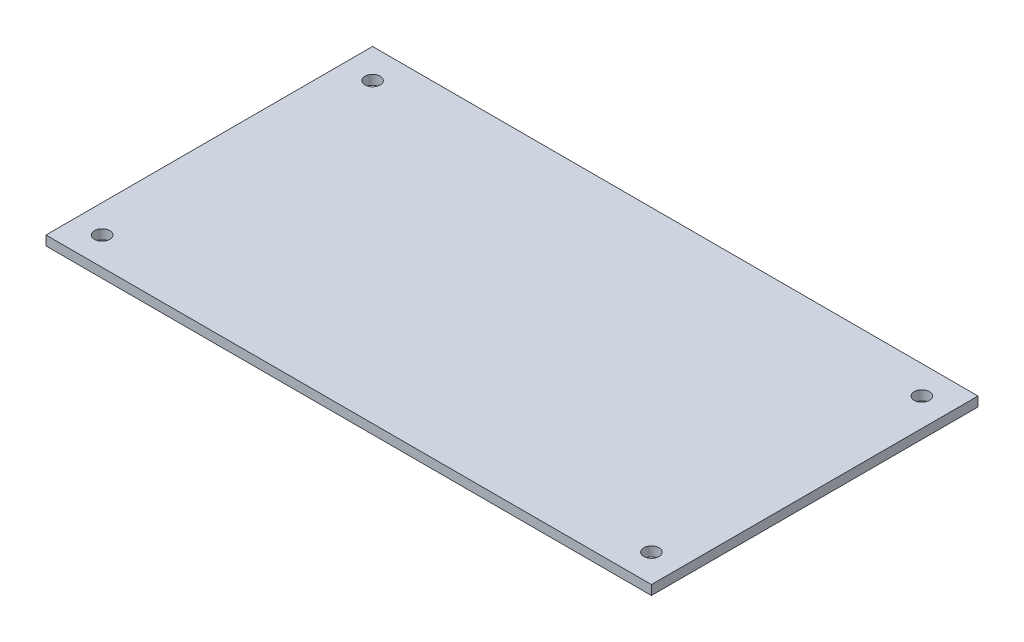
ISO-10303-21;
HEADER;
FILE_DESCRIPTION(('STEP AP214'),'2;1');
FILE_NAME('part.step','',(''),(''),'','','');
FILE_SCHEMA(('AUTOMOTIVE_DESIGN { 1 0 10303 214 1 1 1 1 }'));
ENDSEC;
DATA;
#1=APPLICATION_CONTEXT('core data for automotive mechanical design processes');
#2=APPLICATION_PROTOCOL_DEFINITION('international standard','automotive_design',2000,#1);
#3=PRODUCT_CONTEXT('',#1,'mechanical');
#4=PRODUCT('Part','Part','',(#3));
#5=PRODUCT_RELATED_PRODUCT_CATEGORY('part','',(#4));
#6=PRODUCT_DEFINITION_FORMATION('','',#4);
#7=PRODUCT_DEFINITION_CONTEXT('part definition',#1,'design');
#8=PRODUCT_DEFINITION('design','',#6,#7);
#9=PRODUCT_DEFINITION_SHAPE('','',#8);
#10=(LENGTH_UNIT() NAMED_UNIT(*) SI_UNIT(.MILLI.,.METRE.));
#11=(NAMED_UNIT(*) PLANE_ANGLE_UNIT() SI_UNIT($,.RADIAN.));
#12=(NAMED_UNIT(*) SI_UNIT($,.STERADIAN.) SOLID_ANGLE_UNIT());
#13=UNCERTAINTY_MEASURE_WITH_UNIT(LENGTH_MEASURE(1.E-05),#10,'distance_accuracy_value','');
#14=(GEOMETRIC_REPRESENTATION_CONTEXT(3) GLOBAL_UNCERTAINTY_ASSIGNED_CONTEXT((#13)) GLOBAL_UNIT_ASSIGNED_CONTEXT((#10,
#11,#12)) REPRESENTATION_CONTEXT('',''));
#15=CARTESIAN_POINT('',(0.,0.,0.));
#16=DIRECTION('',(0.,0.,1.));
#17=DIRECTION('',(1.,0.,0.));
#18=AXIS2_PLACEMENT_3D('',#15,#16,#17);
#19=CARTESIAN_POINT('',(26.7239382239382,2.,42.0212355212355));
#20=DIRECTION('',(-1.,0.,0.));
#21=DIRECTION('',(0.,0.,1.));
#22=AXIS2_PLACEMENT_3D('',#19,#20,#21);
#23=PLANE('',#22);
#24=DIRECTION('',(0.,0.,-1.));
#25=VECTOR('',#24,1.);
#26=CARTESIAN_POINT('',(26.7239382239382,0.,42.0212355212355));
#27=LINE('',#26,#25);
#28=CARTESIAN_POINT('',(26.7239382239382,0.,42.0212355212355));
#29=VERTEX_POINT('',#28);
#30=CARTESIAN_POINT('',(26.7239382239382,0.,-26.4787644787645));
#31=VERTEX_POINT('',#30);
#32=EDGE_CURVE('E96',#29,#31,#27,.T.);
#33=ORIENTED_EDGE('',*,*,#32,.T.);
#34=DIRECTION('',(0.,-1.,0.));
#35=VECTOR('',#34,1.);
#36=CARTESIAN_POINT('',(26.7239382239382,2.,-26.4787644787645));
#37=LINE('',#36,#35);
#38=CARTESIAN_POINT('',(26.7239382239382,2.,-26.4787644787645));
#39=VERTEX_POINT('',#38);
#40=EDGE_CURVE('E11',#39,#31,#37,.T.);
#41=ORIENTED_EDGE('',*,*,#40,.F.);
#42=DIRECTION('',(0.,0.,-1.));
#43=VECTOR('',#42,1.);
#44=CARTESIAN_POINT('',(26.7239382239382,2.,42.0212355212355));
#45=LINE('',#44,#43);
#46=CARTESIAN_POINT('',(26.7239382239382,2.,42.0212355212355));
#47=VERTEX_POINT('',#46);
#48=EDGE_CURVE('E84',#47,#39,#45,.T.);
#49=ORIENTED_EDGE('',*,*,#48,.F.);
#50=DIRECTION('',(0.,-1.,0.));
#51=VECTOR('',#50,1.);
#52=CARTESIAN_POINT('',(26.7239382239382,2.,42.0212355212355));
#53=LINE('',#52,#51);
#54=EDGE_CURVE('E92',#47,#29,#53,.T.);
#55=ORIENTED_EDGE('',*,*,#54,.T.);
#56=EDGE_LOOP('',(#33,#41,#49,#55));
#57=FACE_BOUND('',#56,.T.);
#58=ADVANCED_FACE('F33',(#57),#23,.F.);
#59=CARTESIAN_POINT('',(-100.276061776062,2.,-26.4787644787645));
#60=DIRECTION('',(0.,0.,1.));
#61=DIRECTION('',(1.,0.,0.));
#62=AXIS2_PLACEMENT_3D('',#59,#60,#61);
#63=PLANE('',#62);
#64=DIRECTION('',(-1.,0.,0.));
#65=VECTOR('',#64,1.);
#66=CARTESIAN_POINT('',(-100.276061776062,0.,-26.4787644787645));
#67=LINE('',#66,#65);
#68=CARTESIAN_POINT('',(-100.276061776062,0.,-26.4787644787645));
#69=VERTEX_POINT('',#68);
#70=EDGE_CURVE('E88',#31,#69,#67,.T.);
#71=ORIENTED_EDGE('',*,*,#70,.T.);
#72=DIRECTION('',(0.,-1.,0.));
#73=VECTOR('',#72,1.);
#74=CARTESIAN_POINT('',(-100.276061776062,2.,-26.4787644787645));
#75=LINE('',#74,#73);
#76=CARTESIAN_POINT('',(-100.276061776062,2.,-26.4787644787645));
#77=VERTEX_POINT('',#76);
#78=EDGE_CURVE('E41',#77,#69,#75,.T.);
#79=ORIENTED_EDGE('',*,*,#78,.F.);
#80=DIRECTION('',(-1.,0.,0.));
#81=VECTOR('',#80,1.);
#82=CARTESIAN_POINT('',(-100.276061776062,2.,-26.4787644787645));
#83=LINE('',#82,#81);
#84=EDGE_CURVE('E79',#39,#77,#83,.T.);
#85=ORIENTED_EDGE('',*,*,#84,.F.);
#86=ORIENTED_EDGE('',*,*,#40,.T.);
#87=EDGE_LOOP('',(#71,#79,#85,#86));
#88=FACE_BOUND('',#87,.T.);
#89=ADVANCED_FACE('F87',(#88),#63,.F.);
#90=CARTESIAN_POINT('',(-100.276061776062,2.,42.0212355212355));
#91=DIRECTION('',(1.,0.,0.));
#92=DIRECTION('',(0.,0.,-1.));
#93=AXIS2_PLACEMENT_3D('',#90,#91,#92);
#94=PLANE('',#93);
#95=DIRECTION('',(0.,0.,1.));
#96=VECTOR('',#95,1.);
#97=CARTESIAN_POINT('',(-100.276061776062,0.,42.0212355212355));
#98=LINE('',#97,#96);
#99=CARTESIAN_POINT('',(-100.276061776062,0.,42.0212355212355));
#100=VERTEX_POINT('',#99);
#101=EDGE_CURVE('E66',#69,#100,#98,.T.);
#102=ORIENTED_EDGE('',*,*,#101,.T.);
#103=DIRECTION('',(0.,-1.,0.));
#104=VECTOR('',#103,1.);
#105=CARTESIAN_POINT('',(-100.276061776062,2.,42.0212355212355));
#106=LINE('',#105,#104);
#107=CARTESIAN_POINT('',(-100.276061776062,2.,42.0212355212355));
#108=VERTEX_POINT('',#107);
#109=EDGE_CURVE('E89',#108,#100,#106,.T.);
#110=ORIENTED_EDGE('',*,*,#109,.F.);
#111=DIRECTION('',(0.,0.,1.));
#112=VECTOR('',#111,1.);
#113=CARTESIAN_POINT('',(-100.276061776062,2.,42.0212355212355));
#114=LINE('',#113,#112);
#115=EDGE_CURVE('E82',#77,#108,#114,.T.);
#116=ORIENTED_EDGE('',*,*,#115,.F.);
#117=ORIENTED_EDGE('',*,*,#78,.T.);
#118=EDGE_LOOP('',(#102,#110,#116,#117));
#119=FACE_BOUND('',#118,.T.);
#120=ADVANCED_FACE('F90',(#119),#94,.F.);
#121=CARTESIAN_POINT('',(-100.276061776062,2.,42.0212355212355));
#122=DIRECTION('',(0.,0.,-1.));
#123=DIRECTION('',(-1.,0.,0.));
#124=AXIS2_PLACEMENT_3D('',#121,#122,#123);
#125=PLANE('',#124);
#126=DIRECTION('',(1.,0.,0.));
#127=VECTOR('',#126,1.);
#128=CARTESIAN_POINT('',(-100.276061776062,0.,42.0212355212355));
#129=LINE('',#128,#127);
#130=EDGE_CURVE('E72',#100,#29,#129,.T.);
#131=ORIENTED_EDGE('',*,*,#130,.T.);
#132=ORIENTED_EDGE('',*,*,#54,.F.);
#133=DIRECTION('',(1.,0.,0.));
#134=VECTOR('',#133,1.);
#135=CARTESIAN_POINT('',(-100.276061776062,2.,42.0212355212355));
#136=LINE('',#135,#134);
#137=EDGE_CURVE('E49',#108,#47,#136,.T.);
#138=ORIENTED_EDGE('',*,*,#137,.F.);
#139=ORIENTED_EDGE('',*,*,#109,.T.);
#140=EDGE_LOOP('',(#131,#132,#138,#139));
#141=FACE_BOUND('',#140,.T.);
#142=ADVANCED_FACE('F104',(#141),#125,.F.);
#143=CARTESIAN_POINT('',(0.,2.,0.));
#144=DIRECTION('',(0.,-1.,0.));
#145=DIRECTION('',(0.,0.,-1.));
#146=AXIS2_PLACEMENT_3D('',#143,#144,#145);
#147=PLANE('',#146);
#148=CARTESIAN_POINT('',(20.8339382239382,2.,-20.5887644787645));
#149=DIRECTION('',(0.,1.,0.));
#150=DIRECTION('',(0.,0.,1.));
#151=AXIS2_PLACEMENT_3D('',#148,#149,#150);
#152=CIRCLE('',#151,1.6);
#153=CARTESIAN_POINT('',(20.8339382239382,2.,-18.9887644787645));
#154=VERTEX_POINT('',#153);
#155=EDGE_CURVE('E116',#154,#154,#152,.T.);
#156=ORIENTED_EDGE('',*,*,#155,.F.);
#157=EDGE_LOOP('',(#156));
#158=FACE_BOUND('',#157,.T.);
#159=CARTESIAN_POINT('',(20.8339382239382,2.,36.1312355212355));
#160=DIRECTION('',(0.,1.,0.));
#161=DIRECTION('',(0.,0.,1.));
#162=AXIS2_PLACEMENT_3D('',#159,#160,#161);
#163=CIRCLE('',#162,1.6);
#164=CARTESIAN_POINT('',(20.8339382239382,2.,37.7312355212355));
#165=VERTEX_POINT('',#164);
#166=EDGE_CURVE('E122',#165,#165,#163,.T.);
#167=ORIENTED_EDGE('',*,*,#166,.F.);
#168=EDGE_LOOP('',(#167));
#169=FACE_BOUND('',#168,.T.);
#170=CARTESIAN_POINT('',(-94.3860617760618,2.,36.1312355212355));
#171=DIRECTION('',(0.,1.,0.));
#172=DIRECTION('',(0.,0.,1.));
#173=AXIS2_PLACEMENT_3D('',#170,#171,#172);
#174=CIRCLE('',#173,1.60000000000001);
#175=CARTESIAN_POINT('',(-94.3860617760618,2.,37.7312355212355));
#176=VERTEX_POINT('',#175);
#177=EDGE_CURVE('E128',#176,#176,#174,.T.);
#178=ORIENTED_EDGE('',*,*,#177,.F.);
#179=EDGE_LOOP('',(#178));
#180=FACE_BOUND('',#179,.T.);
#181=CARTESIAN_POINT('',(-94.0760617760618,2.,-20.2787644787645));
#182=DIRECTION('',(0.,1.,0.));
#183=DIRECTION('',(0.,0.,1.));
#184=AXIS2_PLACEMENT_3D('',#181,#182,#183);
#185=CIRCLE('',#184,1.6);
#186=CARTESIAN_POINT('',(-94.0760617760618,2.,-18.6787644787645));
#187=VERTEX_POINT('',#186);
#188=EDGE_CURVE('E110',#187,#187,#185,.T.);
#189=ORIENTED_EDGE('',*,*,#188,.F.);
#190=EDGE_LOOP('',(#189));
#191=FACE_BOUND('',#190,.T.);
#192=ORIENTED_EDGE('',*,*,#48,.T.);
#193=ORIENTED_EDGE('',*,*,#84,.T.);
#194=ORIENTED_EDGE('',*,*,#115,.T.);
#195=ORIENTED_EDGE('',*,*,#137,.T.);
#196=EDGE_LOOP('',(#192,#193,#194,#195));
#197=FACE_BOUND('',#196,.T.);
#198=ADVANCED_FACE('F80',(#158,#169,#180,#191,#197),#147,.F.);
#199=CARTESIAN_POINT('',(0.,0.,0.));
#200=DIRECTION('',(0.,-1.,0.));
#201=DIRECTION('',(0.,0.,-1.));
#202=AXIS2_PLACEMENT_3D('',#199,#200,#201);
#203=PLANE('',#202);
#204=CARTESIAN_POINT('',(20.8339382239382,0.,-20.5887644787645));
#205=DIRECTION('',(0.,1.,0.));
#206=DIRECTION('',(0.,0.,1.));
#207=AXIS2_PLACEMENT_3D('',#204,#205,#206);
#208=CIRCLE('',#207,1.6);
#209=CARTESIAN_POINT('',(20.8339382239382,0.,-18.9887644787645));
#210=VERTEX_POINT('',#209);
#211=EDGE_CURVE('E119',#210,#210,#208,.T.);
#212=ORIENTED_EDGE('',*,*,#211,.T.);
#213=EDGE_LOOP('',(#212));
#214=FACE_BOUND('',#213,.T.);
#215=CARTESIAN_POINT('',(20.8339382239382,0.,36.1312355212355));
#216=DIRECTION('',(0.,1.,0.));
#217=DIRECTION('',(0.,0.,1.));
#218=AXIS2_PLACEMENT_3D('',#215,#216,#217);
#219=CIRCLE('',#218,1.6);
#220=CARTESIAN_POINT('',(20.8339382239382,0.,37.7312355212355));
#221=VERTEX_POINT('',#220);
#222=EDGE_CURVE('E125',#221,#221,#219,.T.);
#223=ORIENTED_EDGE('',*,*,#222,.T.);
#224=EDGE_LOOP('',(#223));
#225=FACE_BOUND('',#224,.T.);
#226=CARTESIAN_POINT('',(-94.3860617760618,0.,36.1312355212355));
#227=DIRECTION('',(0.,1.,0.));
#228=DIRECTION('',(0.,0.,1.));
#229=AXIS2_PLACEMENT_3D('',#226,#227,#228);
#230=CIRCLE('',#229,1.60000000000001);
#231=CARTESIAN_POINT('',(-94.3860617760618,0.,37.7312355212355));
#232=VERTEX_POINT('',#231);
#233=EDGE_CURVE('E113',#232,#232,#230,.T.);
#234=ORIENTED_EDGE('',*,*,#233,.T.);
#235=EDGE_LOOP('',(#234));
#236=FACE_BOUND('',#235,.T.);
#237=CARTESIAN_POINT('',(-94.0760617760618,0.,-20.2787644787645));
#238=DIRECTION('',(0.,1.,0.));
#239=DIRECTION('',(0.,0.,1.));
#240=AXIS2_PLACEMENT_3D('',#237,#238,#239);
#241=CIRCLE('',#240,1.6);
#242=CARTESIAN_POINT('',(-94.0760617760618,0.,-18.6787644787645));
#243=VERTEX_POINT('',#242);
#244=EDGE_CURVE('E99',#243,#243,#241,.T.);
#245=ORIENTED_EDGE('',*,*,#244,.T.);
#246=EDGE_LOOP('',(#245));
#247=FACE_BOUND('',#246,.T.);
#248=ORIENTED_EDGE('',*,*,#32,.F.);
#249=ORIENTED_EDGE('',*,*,#130,.F.);
#250=ORIENTED_EDGE('',*,*,#101,.F.);
#251=ORIENTED_EDGE('',*,*,#70,.F.);
#252=EDGE_LOOP('',(#248,#249,#250,#251));
#253=FACE_BOUND('',#252,.T.);
#254=ADVANCED_FACE('F107',(#214,#225,#236,#247,#253),#203,.T.);
#255=CARTESIAN_POINT('',(-94.0760617760618,0.,-20.2787644787645));
#256=DIRECTION('',(0.,1.,0.));
#257=DIRECTION('',(0.,0.,1.));
#258=AXIS2_PLACEMENT_3D('',#255,#256,#257);
#259=CYLINDRICAL_SURFACE('',#258,1.6);
#260=ORIENTED_EDGE('',*,*,#244,.F.);
#261=EDGE_LOOP('',(#260));
#262=FACE_BOUND('',#261,.T.);
#263=ORIENTED_EDGE('',*,*,#188,.T.);
#264=EDGE_LOOP('',(#263));
#265=FACE_BOUND('',#264,.T.);
#266=ADVANCED_FACE('F140',(#262,#265),#259,.F.);
#267=CARTESIAN_POINT('',(-94.3860617760618,0.,36.1312355212355));
#268=DIRECTION('',(0.,1.,0.));
#269=DIRECTION('',(0.,0.,1.));
#270=AXIS2_PLACEMENT_3D('',#267,#268,#269);
#271=CYLINDRICAL_SURFACE('',#270,1.60000000000001);
#272=ORIENTED_EDGE('',*,*,#233,.F.);
#273=EDGE_LOOP('',(#272));
#274=FACE_BOUND('',#273,.T.);
#275=ORIENTED_EDGE('',*,*,#177,.T.);
#276=EDGE_LOOP('',(#275));
#277=FACE_BOUND('',#276,.T.);
#278=ADVANCED_FACE('F136',(#274,#277),#271,.F.);
#279=CARTESIAN_POINT('',(20.8339382239382,0.,36.1312355212355));
#280=DIRECTION('',(0.,1.,0.));
#281=DIRECTION('',(0.,0.,1.));
#282=AXIS2_PLACEMENT_3D('',#279,#280,#281);
#283=CYLINDRICAL_SURFACE('',#282,1.6);
#284=ORIENTED_EDGE('',*,*,#222,.F.);
#285=EDGE_LOOP('',(#284));
#286=FACE_BOUND('',#285,.T.);
#287=ORIENTED_EDGE('',*,*,#166,.T.);
#288=EDGE_LOOP('',(#287));
#289=FACE_BOUND('',#288,.T.);
#290=ADVANCED_FACE('F139',(#286,#289),#283,.F.);
#291=CARTESIAN_POINT('',(20.8339382239382,0.,-20.5887644787645));
#292=DIRECTION('',(0.,1.,0.));
#293=DIRECTION('',(0.,0.,1.));
#294=AXIS2_PLACEMENT_3D('',#291,#292,#293);
#295=CYLINDRICAL_SURFACE('',#294,1.6);
#296=ORIENTED_EDGE('',*,*,#211,.F.);
#297=EDGE_LOOP('',(#296));
#298=FACE_BOUND('',#297,.T.);
#299=ORIENTED_EDGE('',*,*,#155,.T.);
#300=EDGE_LOOP('',(#299));
#301=FACE_BOUND('',#300,.T.);
#302=ADVANCED_FACE('F201',(#298,#301),#295,.F.);
#303=CLOSED_SHELL('',(#58,#89,#120,#142,#198,#254,#266,#278,#290,#302));
#304=MANIFOLD_SOLID_BREP('B2',#303);
#305=ADVANCED_BREP_SHAPE_REPRESENTATION('',(#18,#304),#14);
#306=SHAPE_DEFINITION_REPRESENTATION(#9,#305);
ENDSEC;
END-ISO-10303-21;
